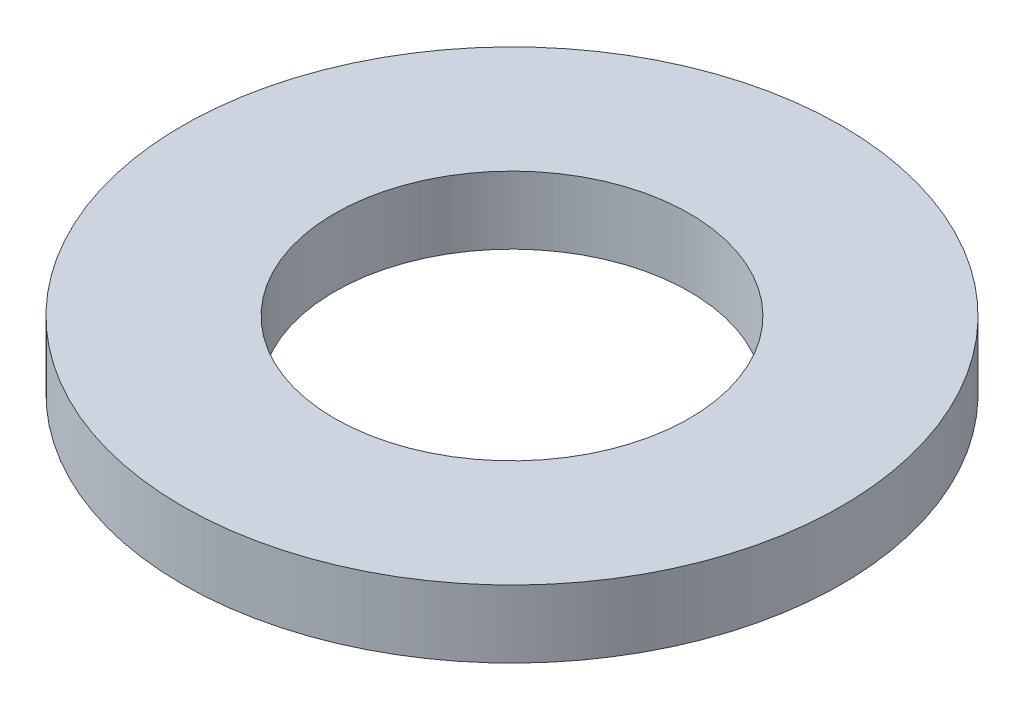
ISO-10303-21;
HEADER;
FILE_DESCRIPTION(('STEP AP214'),'2;1');
FILE_NAME('part.step','',(''),(''),'','','');
FILE_SCHEMA(('AUTOMOTIVE_DESIGN { 1 0 10303 214 1 1 1 1 }'));
ENDSEC;
DATA;
#1=APPLICATION_CONTEXT('core data for automotive mechanical design processes');
#2=APPLICATION_PROTOCOL_DEFINITION('international standard','automotive_design',2000,#1);
#3=PRODUCT_CONTEXT('',#1,'mechanical');
#4=PRODUCT('Part','Part','',(#3));
#5=PRODUCT_RELATED_PRODUCT_CATEGORY('part','',(#4));
#6=PRODUCT_DEFINITION_FORMATION('','',#4);
#7=PRODUCT_DEFINITION_CONTEXT('part definition',#1,'design');
#8=PRODUCT_DEFINITION('design','',#6,#7);
#9=PRODUCT_DEFINITION_SHAPE('','',#8);
#10=(LENGTH_UNIT() NAMED_UNIT(*) SI_UNIT(.MILLI.,.METRE.));
#11=(NAMED_UNIT(*) PLANE_ANGLE_UNIT() SI_UNIT($,.RADIAN.));
#12=(NAMED_UNIT(*) SI_UNIT($,.STERADIAN.) SOLID_ANGLE_UNIT());
#13=UNCERTAINTY_MEASURE_WITH_UNIT(LENGTH_MEASURE(1.E-05),#10,'distance_accuracy_value','');
#14=(GEOMETRIC_REPRESENTATION_CONTEXT(3) GLOBAL_UNCERTAINTY_ASSIGNED_CONTEXT((#13)) GLOBAL_UNIT_ASSIGNED_CONTEXT((#10,
#11,#12)) REPRESENTATION_CONTEXT('',''));
#15=CARTESIAN_POINT('',(0.,0.,0.));
#16=DIRECTION('',(0.,0.,1.));
#17=DIRECTION('',(1.,0.,0.));
#18=AXIS2_PLACEMENT_3D('',#15,#16,#17);
#19=CARTESIAN_POINT('',(0.,1.,0.));
#20=DIRECTION('',(0.,1.,0.));
#21=DIRECTION('',(0.,0.,1.));
#22=AXIS2_PLACEMENT_3D('',#19,#20,#21);
#23=PLANE('',#22);
#24=CARTESIAN_POINT('',(0.,1.,0.));
#25=DIRECTION('',(0.,1.,0.));
#26=DIRECTION('',(0.,0.,1.));
#27=AXIS2_PLACEMENT_3D('',#24,#25,#26);
#28=CIRCLE('',#27,4.875);
#29=CARTESIAN_POINT('',(0.,1.,4.875));
#30=VERTEX_POINT('',#29);
#31=EDGE_CURVE('E10',#30,#30,#28,.T.);
#32=ORIENTED_EDGE('',*,*,#31,.T.);
#33=EDGE_LOOP('',(#32));
#34=FACE_BOUND('',#33,.T.);
#35=CARTESIAN_POINT('',(0.,1.,0.));
#36=DIRECTION('',(0.,1.,0.));
#37=DIRECTION('',(0.,0.,1.));
#38=AXIS2_PLACEMENT_3D('',#35,#36,#37);
#39=CIRCLE('',#38,2.625);
#40=CARTESIAN_POINT('',(0.,1.,2.625));
#41=VERTEX_POINT('',#40);
#42=EDGE_CURVE('E42',#41,#41,#39,.T.);
#43=ORIENTED_EDGE('',*,*,#42,.F.);
#44=EDGE_LOOP('',(#43));
#45=FACE_BOUND('',#44,.T.);
#46=ADVANCED_FACE('F31',(#34,#45),#23,.T.);
#47=CARTESIAN_POINT('',(0.,0.,0.));
#48=DIRECTION('',(0.,1.,0.));
#49=DIRECTION('',(0.,0.,1.));
#50=AXIS2_PLACEMENT_3D('',#47,#48,#49);
#51=PLANE('',#50);
#52=CARTESIAN_POINT('',(0.,0.,0.));
#53=DIRECTION('',(0.,1.,0.));
#54=DIRECTION('',(0.,0.,1.));
#55=AXIS2_PLACEMENT_3D('',#52,#53,#54);
#56=CIRCLE('',#55,4.875);
#57=CARTESIAN_POINT('',(0.,0.,4.875));
#58=VERTEX_POINT('',#57);
#59=EDGE_CURVE('E35',#58,#58,#56,.T.);
#60=ORIENTED_EDGE('',*,*,#59,.F.);
#61=EDGE_LOOP('',(#60));
#62=FACE_BOUND('',#61,.T.);
#63=CARTESIAN_POINT('',(0.,0.,0.));
#64=DIRECTION('',(0.,1.,0.));
#65=DIRECTION('',(0.,0.,1.));
#66=AXIS2_PLACEMENT_3D('',#63,#64,#65);
#67=CIRCLE('',#66,2.625);
#68=CARTESIAN_POINT('',(0.,0.,2.625));
#69=VERTEX_POINT('',#68);
#70=EDGE_CURVE('E44',#69,#69,#67,.T.);
#71=ORIENTED_EDGE('',*,*,#70,.T.);
#72=EDGE_LOOP('',(#71));
#73=FACE_BOUND('',#72,.T.);
#74=ADVANCED_FACE('F54',(#62,#73),#51,.F.);
#75=CARTESIAN_POINT('',(0.,1.,0.));
#76=DIRECTION('',(0.,-1.,0.));
#77=DIRECTION('',(0.,0.,-1.));
#78=AXIS2_PLACEMENT_3D('',#75,#76,#77);
#79=CYLINDRICAL_SURFACE('',#78,4.875);
#80=ORIENTED_EDGE('',*,*,#31,.F.);
#81=EDGE_LOOP('',(#80));
#82=FACE_BOUND('',#81,.T.);
#83=ORIENTED_EDGE('',*,*,#59,.T.);
#84=EDGE_LOOP('',(#83));
#85=FACE_BOUND('',#84,.T.);
#86=ADVANCED_FACE('F33',(#82,#85),#79,.T.);
#87=CARTESIAN_POINT('',(0.,1.,0.));
#88=DIRECTION('',(0.,-1.,0.));
#89=DIRECTION('',(0.,0.,-1.));
#90=AXIS2_PLACEMENT_3D('',#87,#88,#89);
#91=CYLINDRICAL_SURFACE('',#90,2.625);
#92=ORIENTED_EDGE('',*,*,#42,.T.);
#93=EDGE_LOOP('',(#92));
#94=FACE_BOUND('',#93,.T.);
#95=ORIENTED_EDGE('',*,*,#70,.F.);
#96=EDGE_LOOP('',(#95));
#97=FACE_BOUND('',#96,.T.);
#98=ADVANCED_FACE('F50',(#94,#97),#91,.F.);
#99=CLOSED_SHELL('',(#46,#74,#86,#98));
#100=MANIFOLD_SOLID_BREP('B2',#99);
#101=ADVANCED_BREP_SHAPE_REPRESENTATION('',(#18,#100),#14);
#102=SHAPE_DEFINITION_REPRESENTATION(#9,#101);
ENDSEC;
END-ISO-10303-21;
